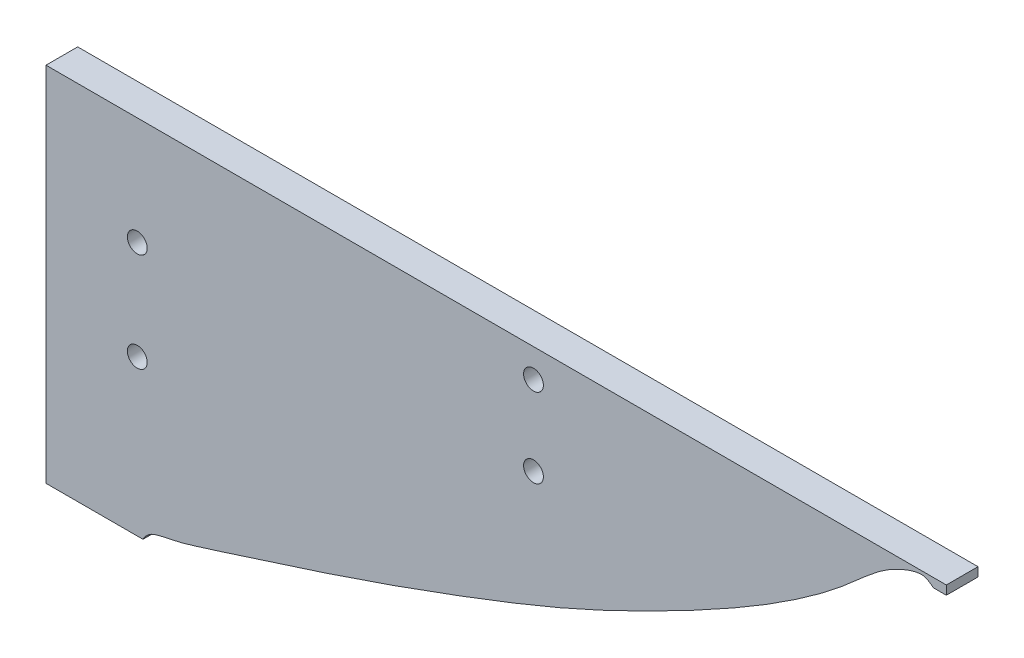
ISO-10303-21;
HEADER;
FILE_DESCRIPTION(('STEP AP214'),'2;1');
FILE_NAME('part.step','',(''),(''),'','','');
FILE_SCHEMA(('AUTOMOTIVE_DESIGN { 1 0 10303 214 1 1 1 1 }'));
ENDSEC;
DATA;
#1=APPLICATION_CONTEXT('core data for automotive mechanical design processes');
#2=APPLICATION_PROTOCOL_DEFINITION('international standard','automotive_design',2000,#1);
#3=PRODUCT_CONTEXT('',#1,'mechanical');
#4=PRODUCT('Part','Part','',(#3));
#5=PRODUCT_RELATED_PRODUCT_CATEGORY('part','',(#4));
#6=PRODUCT_DEFINITION_FORMATION('','',#4);
#7=PRODUCT_DEFINITION_CONTEXT('part definition',#1,'design');
#8=PRODUCT_DEFINITION('design','',#6,#7);
#9=PRODUCT_DEFINITION_SHAPE('','',#8);
#10=(LENGTH_UNIT() NAMED_UNIT(*) SI_UNIT(.MILLI.,.METRE.));
#11=(NAMED_UNIT(*) PLANE_ANGLE_UNIT() SI_UNIT($,.RADIAN.));
#12=(NAMED_UNIT(*) SI_UNIT($,.STERADIAN.) SOLID_ANGLE_UNIT());
#13=UNCERTAINTY_MEASURE_WITH_UNIT(LENGTH_MEASURE(1.E-05),#10,'distance_accuracy_value','');
#14=(GEOMETRIC_REPRESENTATION_CONTEXT(3) GLOBAL_UNCERTAINTY_ASSIGNED_CONTEXT((#13)) GLOBAL_UNIT_ASSIGNED_CONTEXT((#10,
#11,#12)) REPRESENTATION_CONTEXT('',''));
#15=CARTESIAN_POINT('',(0.,0.,0.));
#16=DIRECTION('',(0.,0.,1.));
#17=DIRECTION('',(1.,0.,0.));
#18=AXIS2_PLACEMENT_3D('',#15,#16,#17);
#19=CARTESIAN_POINT('',(5.3465749937326,-52.1213664446041,172.));
#20=DIRECTION('',(0.,0.,-1.));
#21=DIRECTION('',(-1.,0.,0.));
#22=AXIS2_PLACEMENT_3D('',#19,#20,#21);
#23=PLANE('',#22);
#24=CARTESIAN_POINT('',(-100.,-50.,172.));
#25=DIRECTION('',(0.,0.,-1.));
#26=DIRECTION('',(-1.,0.,0.));
#27=AXIS2_PLACEMENT_3D('',#24,#25,#26);
#28=CIRCLE('',#27,2.5);
#29=CARTESIAN_POINT('',(-102.5,-50.,172.));
#30=VERTEX_POINT('',#29);
#31=EDGE_CURVE('E242',#30,#30,#28,.F.);
#32=ORIENTED_EDGE('',*,*,#31,.F.);
#33=EDGE_LOOP('',(#32));
#34=FACE_BOUND('',#33,.T.);
#35=CARTESIAN_POINT('',(0.0705666698621599,-4.96037406111782,172.));
#36=DIRECTION('',(0.,0.,-1.));
#37=DIRECTION('',(-1.,0.,0.));
#38=AXIS2_PLACEMENT_3D('',#35,#36,#37);
#39=CIRCLE('',#38,2.5);
#40=CARTESIAN_POINT('',(-2.42943333013784,-4.96037406111782,172.));
#41=VERTEX_POINT('',#40);
#42=EDGE_CURVE('E238',#41,#41,#39,.F.);
#43=ORIENTED_EDGE('',*,*,#42,.F.);
#44=EDGE_LOOP('',(#43));
#45=FACE_BOUND('',#44,.T.);
#46=CARTESIAN_POINT('',(100.970721138816,0.,172.));
#47=CARTESIAN_POINT('',(100.937143984889,0.0671630142842144,172.));
#48=CARTESIAN_POINT('',(100.892957933651,0.12830917154544,172.));
#49=CARTESIAN_POINT('',(100.7918232478,0.236244274097825,172.));
#50=CARTESIAN_POINT('',(100.734243074779,0.284521266900521,172.));
#51=CARTESIAN_POINT('',(100.554308230617,0.418438841701149,172.));
#52=CARTESIAN_POINT('',(100.427068587045,0.496099921758563,172.));
#53=CARTESIAN_POINT('',(100.174029914827,0.653720018802889,172.));
#54=CARTESIAN_POINT('',(100.049250828068,0.735305953629353,172.));
#55=CARTESIAN_POINT('',(99.7959968868066,0.892582673220089,172.));
#56=CARTESIAN_POINT('',(99.6668355637838,0.967359721666077,172.));
#57=CARTESIAN_POINT('',(99.4014652777744,1.10492965349398,172.));
#58=CARTESIAN_POINT('',(99.2667520085641,1.16755174673251,172.));
#59=CARTESIAN_POINT('',(98.989629704436,1.26941078880054,172.));
#60=CARTESIAN_POINT('',(98.8469731584512,1.30789562507074,172.));
#61=CARTESIAN_POINT('',(98.5545011495643,1.36311147709683,172.));
#62=CARTESIAN_POINT('',(98.404531252504,1.3796333940752,172.));
#63=CARTESIAN_POINT('',(98.1079482415363,1.39455654052937,172.));
#64=CARTESIAN_POINT('',(97.9600153986431,1.39326553424899,172.));
#65=CARTESIAN_POINT('',(97.5169672388434,1.37108097846786,172.));
#66=CARTESIAN_POINT('',(97.2217517236348,1.33203841221391,172.));
#67=CARTESIAN_POINT('',(96.6361604767817,1.22885113425226,172.));
#68=CARTESIAN_POINT('',(96.3473979833977,1.16565581343159,172.));
#69=CARTESIAN_POINT('',(95.4917914564663,0.945345074007086,172.));
#70=CARTESIAN_POINT('',(94.9353050128339,0.758435063719706,172.));
#71=CARTESIAN_POINT('',(93.8352721530819,0.347391824299859,172.));
#72=CARTESIAN_POINT('',(93.2922955891301,0.121619361252646,172.));
#73=CARTESIAN_POINT('',(92.2188581167213,-0.365928037248908,172.));
#74=CARTESIAN_POINT('',(91.6879711513455,-0.627268886462194,172.));
#75=CARTESIAN_POINT('',(90.1323157641524,-1.44984119985145,172.));
#76=CARTESIAN_POINT('',(89.1383660305235,-2.05429107250875,172.));
#77=CARTESIAN_POINT('',(86.2796066329252,-4.02756705873377,172.));
#78=CARTESIAN_POINT('',(84.5279921344107,-5.54346377629478,172.));
#79=CARTESIAN_POINT('',(81.9218530789298,-7.84496072625825,172.));
#80=CARTESIAN_POINT('',(81.0555571550781,-8.61526682458123,172.));
#81=CARTESIAN_POINT('',(79.3064723040644,-10.1344502265541,172.));
#82=CARTESIAN_POINT('',(78.4253946679848,-10.8855509521329,172.));
#83=CARTESIAN_POINT('',(75.7475612493525,-13.0938978700327,172.));
#84=CARTESIAN_POINT('',(73.9178401172508,-14.5042591950759,172.));
#85=CARTESIAN_POINT('',(70.2051758167612,-17.2374865710006,172.));
#86=CARTESIAN_POINT('',(68.3212967840875,-18.5617148784408,172.));
#87=CARTESIAN_POINT('',(64.5130705707045,-21.147904633979,172.));
#88=CARTESIAN_POINT('',(62.5878377572783,-22.4085033914057,172.));
#89=CARTESIAN_POINT('',(58.6955272335455,-24.8653156938211,172.));
#90=CARTESIAN_POINT('',(56.729033607721,-26.0624279482406,172.));
#91=CARTESIAN_POINT('',(52.7640855094267,-28.4074754712496,172.));
#92=CARTESIAN_POINT('',(50.7657478943056,-29.5555905439677,172.));
#93=CARTESIAN_POINT('',(46.7462812540538,-31.8167523803714,172.));
#94=CARTESIAN_POINT('',(44.7248894575554,-32.9295593332157,172.));
#95=CARTESIAN_POINT('',(38.6366147885388,-36.218318883597,172.));
#96=CARTESIAN_POINT('',(34.5439243441606,-38.3469514944818,172.));
#97=CARTESIAN_POINT('',(26.3041288145536,-42.5001859626545,172.));
#98=CARTESIAN_POINT('',(22.1588751473303,-44.5242013215348,172.));
#99=CARTESIAN_POINT('',(13.8020521552322,-48.434657446594,172.));
#100=CARTESIAN_POINT('',(9.58925206741187,-50.3166142665798,172.));
#101=CARTESIAN_POINT('',(1.10389792005377,-53.9261186226283,172.));
#102=CARTESIAN_POINT('',(-3.16965839636964,-55.6553036373644,172.));
#103=CARTESIAN_POINT('',(-11.7557136420966,-59.0183739598217,172.));
#104=CARTESIAN_POINT('',(-16.0670882084985,-60.6559879065782,172.));
#105=CARTESIAN_POINT('',(-24.7104276599877,-63.8763184677953,172.));
#106=CARTESIAN_POINT('',(-29.0422415777458,-65.4577623499878,172.));
#107=CARTESIAN_POINT('',(-37.7305358777393,-68.5508115946746,172.));
#108=CARTESIAN_POINT('',(-42.087494292581,-70.0610634964963,172.));
#109=CARTESIAN_POINT('',(-50.8258411367041,-73.0123982448723,172.));
#110=CARTESIAN_POINT('',(-55.207266370663,-74.4535000257743,172.));
#111=CARTESIAN_POINT('',(-63.9811224506532,-77.3004555359724,172.));
#112=CARTESIAN_POINT('',(-68.3730580194176,-78.7084871466127,172.));
#113=CARTESIAN_POINT('',(-74.9633887642306,-80.8128537311599,172.));
#114=CARTESIAN_POINT('',(-77.1605658290607,-81.5130509458673,172.));
#115=CARTESIAN_POINT('',(-80.4591657952518,-82.5543998727962,172.));
#116=CARTESIAN_POINT('',(-81.5591923717393,-82.8999848812866,172.));
#117=CARTESIAN_POINT('',(-83.7600931405502,-83.58834217406,172.));
#118=CARTESIAN_POINT('',(-84.8600702154096,-83.9341013353587,172.));
#119=CARTESIAN_POINT('',(-87.0661453917024,-84.6051798129182,172.));
#120=CARTESIAN_POINT('',(-88.1733544426353,-84.9269083455371,172.));
#121=CARTESIAN_POINT('',(-89.8493783968855,-85.358347144698,172.));
#122=CARTESIAN_POINT('',(-90.4102721640395,-85.4939221135743,172.));
#123=CARTESIAN_POINT('',(-91.536884929403,-85.7471594747468,172.));
#124=CARTESIAN_POINT('',(-92.1034051485897,-85.8618475157741,172.));
#125=CARTESIAN_POINT('',(-93.2384684602684,-86.0837141391985,172.));
#126=CARTESIAN_POINT('',(-93.8059079401686,-86.194989633192,172.));
#127=CARTESIAN_POINT('',(-94.6469748492172,-86.3993682904544,172.));
#128=CARTESIAN_POINT('',(-94.9257008271005,-86.47354424721,172.));
#129=CARTESIAN_POINT('',(-95.4779747621524,-86.6411183889464,172.));
#130=CARTESIAN_POINT('',(-95.7514624493921,-86.7347403123772,172.));
#131=CARTESIAN_POINT('',(-96.2886341570568,-86.9583780501341,172.));
#132=CARTESIAN_POINT('',(-96.5531516672899,-87.0885615066675,172.));
#133=CARTESIAN_POINT('',(-97.062570593168,-87.4083895415917,172.));
#134=CARTESIAN_POINT('',(-97.2928936459848,-87.5945267042762,172.));
#135=CARTESIAN_POINT('',(-97.612836337745,-87.9011980990851,172.));
#136=CARTESIAN_POINT('',(-97.7156600616324,-88.0075337412868,172.));
#137=CARTESIAN_POINT('',(-97.9138219871909,-88.2282543423036,172.));
#138=CARTESIAN_POINT('',(-98.0094753876009,-88.3423003622484,172.));
#139=CARTESIAN_POINT('',(-98.2008713928624,-88.5702964789981,172.));
#140=CARTESIAN_POINT('',(-98.2955142901703,-88.6851966751947,172.));
#141=CARTESIAN_POINT('',(-98.4639500946093,-88.9304343972609,172.));
#142=CARTESIAN_POINT('',(-98.5369428664735,-89.0639017310369,172.));
#143=CARTESIAN_POINT('',(-98.5654782066456,-89.2102850785614,172.));
#144=B_SPLINE_CURVE_WITH_KNOTS('',3,(#46,#47,#48,#49,#50,#51,#52,#53,#54,#55,#56,#57,#58,#59,
#60,#61,#62,#63,#64,#65,#66,#67,#68,#69,#70,#71,#72,#73,#74,#75,#76,#77,#78,#79,#80,#81,#82,#83,
#84,#85,#86,#87,#88,#89,#90,#91,#92,#93,#94,#95,#96,#97,#98,#99,#100,#101,#102,#103,#104,#105,
#106,#107,#108,#109,#110,#111,#112,#113,#114,#115,#116,#117,#118,#119,#120,#121,#122,#123,#124,
#125,#126,#127,#128,#129,#130,#131,#132,#133,#134,#135,#136,#137,#138,#139,#140,#141,#142,#143),
.UNSPECIFIED.,.F.,.F.,(4,2,2,2,2,2,2,2,2,2,2,2,2,2,2,2,2,2,2,2,2,2,2,2,2,2,2,2,2,2,2,2,2,2,2,2,
2,2,2,2,2,2,2,2,2,2,2,2,4),(0.,0.0009765625,0.001953125,0.00390624999999989,0.00585937499999967,
0.00781249999999956,0.00976562499999944,0.0117187499999992,0.0136718749999991,0.015624999999999,
0.0195312499999989,0.0234374999999987,0.0312499999999987,0.0390624999999987,0.0468749999999986,
0.0624999999999984,0.0937499999999982,0.109374999999998,0.124999999999998,0.156249999999998,
0.187499999999998,0.218749999999998,0.249999999999998,0.281249999999998,0.312499999999999,
0.374999999999999,0.437499999999999,0.499999999999999,0.562499999999999,0.624999999999999,
0.687499999999999,0.749999999999999,0.8125,0.875,0.90625,0.921875,0.9375,0.953125,0.9609375,
0.96875,0.9765625,0.98046875,0.984375,0.98828125,0.9921875,0.994140625,0.99609375,0.998046875,
1.),.UNSPECIFIED.);
#145=CARTESIAN_POINT('',(-98.5654782066456,-89.2102850785613,172.));
#146=VERTEX_POINT('',#145);
#147=CARTESIAN_POINT('',(100.970721138816,0.,172.));
#148=VERTEX_POINT('',#147);
#149=EDGE_CURVE('E196',#146,#148,#144,.F.);
#150=ORIENTED_EDGE('',*,*,#149,.T.);
#151=DIRECTION('',(1.,0.,0.));
#152=VECTOR('',#151,1.);
#153=CARTESIAN_POINT('',(100.970721138816,0.,172.));
#154=LINE('',#153,#152);
#155=CARTESIAN_POINT('',(104.340662266709,0.,172.));
#156=VERTEX_POINT('',#155);
#157=EDGE_CURVE('E90',#148,#156,#154,.T.);
#158=ORIENTED_EDGE('',*,*,#157,.T.);
#159=DIRECTION('',(0.,1.,0.));
#160=VECTOR('',#159,1.);
#161=CARTESIAN_POINT('',(104.340662266709,2.25600000000004,172.));
#162=LINE('',#161,#160);
#163=CARTESIAN_POINT('',(104.340662266709,2.25600000000004,172.));
#164=VERTEX_POINT('',#163);
#165=EDGE_CURVE('E103',#156,#164,#162,.T.);
#166=ORIENTED_EDGE('',*,*,#165,.T.);
#167=DIRECTION('',(-1.,0.,0.));
#168=VECTOR('',#167,1.);
#169=CARTESIAN_POINT('',(104.340662266709,2.25600000000004,172.));
#170=LINE('',#169,#168);
#171=CARTESIAN_POINT('',(-123.056286661336,2.25600000000002,172.));
#172=VERTEX_POINT('',#171);
#173=EDGE_CURVE('E97',#164,#172,#170,.T.);
#174=ORIENTED_EDGE('',*,*,#173,.T.);
#175=DIRECTION('',(0.,-1.,0.));
#176=VECTOR('',#175,1.);
#177=CARTESIAN_POINT('',(-123.056286661336,-89.22001834219,172.));
#178=LINE('',#177,#176);
#179=CARTESIAN_POINT('',(-123.056286661336,-89.22001834219,172.));
#180=VERTEX_POINT('',#179);
#181=EDGE_CURVE('E101',#172,#180,#178,.T.);
#182=ORIENTED_EDGE('',*,*,#181,.T.);
#183=CARTESIAN_POINT('',(-98.5654782066456,-89.2102850785613,172.));
#184=CARTESIAN_POINT('',(-106.729080407975,-89.2148236384681,172.));
#185=CARTESIAN_POINT('',(-114.892683458794,-89.2179564181053,172.));
#186=CARTESIAN_POINT('',(-123.056286661336,-89.22001834219,172.));
#187=B_SPLINE_CURVE_WITH_KNOTS('',3,(#183,#184,#185,#186),.UNSPECIFIED.,.F.,.F.,(4,4),(0.,1.),.UNSPECIFIED.);
#188=EDGE_CURVE('E51',#180,#146,#187,.F.);
#189=ORIENTED_EDGE('',*,*,#188,.T.);
#190=EDGE_LOOP('',(#150,#158,#166,#174,#182,#189));
#191=FACE_BOUND('',#190,.T.);
#192=CARTESIAN_POINT('',(0.0705666698621599,-25.,172.));
#193=DIRECTION('',(0.,0.,-1.));
#194=DIRECTION('',(-1.,0.,0.));
#195=AXIS2_PLACEMENT_3D('',#192,#193,#194);
#196=CIRCLE('',#195,2.5);
#197=CARTESIAN_POINT('',(-2.42943333013784,-25.,172.));
#198=VERTEX_POINT('',#197);
#199=EDGE_CURVE('E239',#198,#198,#196,.F.);
#200=ORIENTED_EDGE('',*,*,#199,.F.);
#201=EDGE_LOOP('',(#200));
#202=FACE_BOUND('',#201,.T.);
#203=CARTESIAN_POINT('',(-100.,-25.,172.));
#204=DIRECTION('',(0.,0.,-1.));
#205=DIRECTION('',(-1.,0.,0.));
#206=AXIS2_PLACEMENT_3D('',#203,#204,#205);
#207=CIRCLE('',#206,2.5);
#208=CARTESIAN_POINT('',(-102.5,-25.,172.));
#209=VERTEX_POINT('',#208);
#210=EDGE_CURVE('E245',#209,#209,#207,.F.);
#211=ORIENTED_EDGE('',*,*,#210,.F.);
#212=EDGE_LOOP('',(#211));
#213=FACE_BOUND('',#212,.T.);
#214=ADVANCED_FACE('F30',(#34,#45,#191,#202,#213),#23,.F.);
#215=CARTESIAN_POINT('',(5.3465749937326,-52.1213664446041,164.));
#216=DIRECTION('',(0.,0.,-1.));
#217=DIRECTION('',(-1.,0.,0.));
#218=AXIS2_PLACEMENT_3D('',#215,#216,#217);
#219=PLANE('',#218);
#220=CARTESIAN_POINT('',(-100.,-50.,164.));
#221=DIRECTION('',(0.,0.,-1.));
#222=DIRECTION('',(-1.,0.,0.));
#223=AXIS2_PLACEMENT_3D('',#220,#221,#222);
#224=CIRCLE('',#223,2.5);
#225=CARTESIAN_POINT('',(-102.5,-50.,164.));
#226=VERTEX_POINT('',#225);
#227=EDGE_CURVE('E243',#226,#226,#224,.F.);
#228=ORIENTED_EDGE('',*,*,#227,.T.);
#229=EDGE_LOOP('',(#228));
#230=FACE_BOUND('',#229,.T.);
#231=CARTESIAN_POINT('',(0.0705666698621599,-4.96037406111782,164.));
#232=DIRECTION('',(0.,0.,-1.));
#233=DIRECTION('',(-1.,0.,0.));
#234=AXIS2_PLACEMENT_3D('',#231,#232,#233);
#235=CIRCLE('',#234,2.5);
#236=CARTESIAN_POINT('',(-2.42943333013784,-4.96037406111782,164.));
#237=VERTEX_POINT('',#236);
#238=EDGE_CURVE('E235',#237,#237,#235,.F.);
#239=ORIENTED_EDGE('',*,*,#238,.T.);
#240=EDGE_LOOP('',(#239));
#241=FACE_BOUND('',#240,.T.);
#242=CARTESIAN_POINT('',(-98.5654782066456,-89.2102850785614,164.));
#243=CARTESIAN_POINT('',(-98.5369428664735,-89.0639017310369,164.));
#244=CARTESIAN_POINT('',(-98.4639500946093,-88.9304343972609,164.));
#245=CARTESIAN_POINT('',(-98.2955142901703,-88.6851966751947,164.));
#246=CARTESIAN_POINT('',(-98.2008713928624,-88.5702964789981,164.));
#247=CARTESIAN_POINT('',(-98.0094753876009,-88.3423003622484,164.));
#248=CARTESIAN_POINT('',(-97.9138219871909,-88.2282543423036,164.));
#249=CARTESIAN_POINT('',(-97.7156600616324,-88.0075337412868,164.));
#250=CARTESIAN_POINT('',(-97.612836337745,-87.9011980990851,164.));
#251=CARTESIAN_POINT('',(-97.2928936459848,-87.5945267042762,164.));
#252=CARTESIAN_POINT('',(-97.062570593168,-87.4083895415917,164.));
#253=CARTESIAN_POINT('',(-96.5531516672899,-87.0885615066675,164.));
#254=CARTESIAN_POINT('',(-96.2886341570568,-86.9583780501341,164.));
#255=CARTESIAN_POINT('',(-95.7514624493921,-86.7347403123772,164.));
#256=CARTESIAN_POINT('',(-95.4779747621524,-86.6411183889464,164.));
#257=CARTESIAN_POINT('',(-94.9257008271005,-86.47354424721,164.));
#258=CARTESIAN_POINT('',(-94.6469748492172,-86.3993682904544,164.));
#259=CARTESIAN_POINT('',(-93.8059079401686,-86.194989633192,164.));
#260=CARTESIAN_POINT('',(-93.2384684602684,-86.0837141391985,164.));
#261=CARTESIAN_POINT('',(-92.1034051485897,-85.8618475157741,164.));
#262=CARTESIAN_POINT('',(-91.536884929403,-85.7471594747468,164.));
#263=CARTESIAN_POINT('',(-90.4102721640395,-85.4939221135743,164.));
#264=CARTESIAN_POINT('',(-89.8493783968855,-85.358347144698,164.));
#265=CARTESIAN_POINT('',(-88.1733544426353,-84.9269083455371,164.));
#266=CARTESIAN_POINT('',(-87.0661453917024,-84.6051798129182,164.));
#267=CARTESIAN_POINT('',(-84.8600702154096,-83.9341013353587,164.));
#268=CARTESIAN_POINT('',(-83.7600931405502,-83.58834217406,164.));
#269=CARTESIAN_POINT('',(-81.5591923717393,-82.8999848812866,164.));
#270=CARTESIAN_POINT('',(-80.4591657952518,-82.5543998727962,164.));
#271=CARTESIAN_POINT('',(-77.1605658290607,-81.5130509458673,164.));
#272=CARTESIAN_POINT('',(-74.9633887642306,-80.8128537311599,164.));
#273=CARTESIAN_POINT('',(-68.3730580194176,-78.7084871466127,164.));
#274=CARTESIAN_POINT('',(-63.9811224506532,-77.3004555359724,164.));
#275=CARTESIAN_POINT('',(-55.207266370663,-74.4535000257743,164.));
#276=CARTESIAN_POINT('',(-50.8258411367041,-73.0123982448723,164.));
#277=CARTESIAN_POINT('',(-42.087494292581,-70.0610634964963,164.));
#278=CARTESIAN_POINT('',(-37.7305358777393,-68.5508115946746,164.));
#279=CARTESIAN_POINT('',(-29.0422415777458,-65.4577623499878,164.));
#280=CARTESIAN_POINT('',(-24.7104276599877,-63.8763184677953,164.));
#281=CARTESIAN_POINT('',(-16.0670882084985,-60.6559879065782,164.));
#282=CARTESIAN_POINT('',(-11.7557136420966,-59.0183739598217,164.));
#283=CARTESIAN_POINT('',(-3.16965839636964,-55.6553036373644,164.));
#284=CARTESIAN_POINT('',(1.10389792005377,-53.9261186226283,164.));
#285=CARTESIAN_POINT('',(9.58925206741187,-50.3166142665798,164.));
#286=CARTESIAN_POINT('',(13.8020521552322,-48.434657446594,164.));
#287=CARTESIAN_POINT('',(22.1588751473303,-44.5242013215348,164.));
#288=CARTESIAN_POINT('',(26.3041288145536,-42.5001859626545,164.));
#289=CARTESIAN_POINT('',(34.5439243441606,-38.3469514944818,164.));
#290=CARTESIAN_POINT('',(38.6366147885388,-36.218318883597,164.));
#291=CARTESIAN_POINT('',(44.7248894575554,-32.9295593332157,164.));
#292=CARTESIAN_POINT('',(46.7462812540538,-31.8167523803714,164.));
#293=CARTESIAN_POINT('',(50.7657478943056,-29.5555905439677,164.));
#294=CARTESIAN_POINT('',(52.7640855094267,-28.4074754712496,164.));
#295=CARTESIAN_POINT('',(56.729033607721,-26.0624279482406,164.));
#296=CARTESIAN_POINT('',(58.6955272335455,-24.8653156938211,164.));
#297=CARTESIAN_POINT('',(62.5878377572783,-22.4085033914057,164.));
#298=CARTESIAN_POINT('',(64.5130705707045,-21.147904633979,164.));
#299=CARTESIAN_POINT('',(68.3212967840875,-18.5617148784408,164.));
#300=CARTESIAN_POINT('',(70.2051758167612,-17.2374865710006,164.));
#301=CARTESIAN_POINT('',(73.9178401172508,-14.5042591950759,164.));
#302=CARTESIAN_POINT('',(75.7475612493525,-13.0938978700327,164.));
#303=CARTESIAN_POINT('',(78.4253946679848,-10.8855509521329,164.));
#304=CARTESIAN_POINT('',(79.3064723040644,-10.1344502265541,164.));
#305=CARTESIAN_POINT('',(81.0555571550781,-8.61526682458123,164.));
#306=CARTESIAN_POINT('',(81.9218530789298,-7.84496072625825,164.));
#307=CARTESIAN_POINT('',(84.5279921344107,-5.54346377629478,164.));
#308=CARTESIAN_POINT('',(86.2796066329252,-4.02756705873377,164.));
#309=CARTESIAN_POINT('',(89.1383660305235,-2.05429107250875,164.));
#310=CARTESIAN_POINT('',(90.1323157641524,-1.44984119985145,164.));
#311=CARTESIAN_POINT('',(91.6879711513455,-0.627268886462194,164.));
#312=CARTESIAN_POINT('',(92.2188581167213,-0.365928037248908,164.));
#313=CARTESIAN_POINT('',(93.2922955891301,0.121619361252646,164.));
#314=CARTESIAN_POINT('',(93.8352721530819,0.347391824299859,164.));
#315=CARTESIAN_POINT('',(94.9353050128339,0.758435063719706,164.));
#316=CARTESIAN_POINT('',(95.4917914564663,0.945345074007086,164.));
#317=CARTESIAN_POINT('',(96.3473979833977,1.16565581343159,164.));
#318=CARTESIAN_POINT('',(96.6361604767817,1.22885113425226,164.));
#319=CARTESIAN_POINT('',(97.2217517236348,1.33203841221391,164.));
#320=CARTESIAN_POINT('',(97.5169672388434,1.37108097846786,164.));
#321=CARTESIAN_POINT('',(97.9600153986431,1.39326553424899,164.));
#322=CARTESIAN_POINT('',(98.1079482415363,1.39455654052937,164.));
#323=CARTESIAN_POINT('',(98.404531252504,1.3796333940752,164.));
#324=CARTESIAN_POINT('',(98.5545011495643,1.36311147709683,164.));
#325=CARTESIAN_POINT('',(98.8469731584512,1.30789562507074,164.));
#326=CARTESIAN_POINT('',(98.989629704436,1.26941078880054,164.));
#327=CARTESIAN_POINT('',(99.2667520085641,1.16755174673251,164.));
#328=CARTESIAN_POINT('',(99.4014652777744,1.10492965349398,164.));
#329=CARTESIAN_POINT('',(99.6668355637838,0.967359721666077,164.));
#330=CARTESIAN_POINT('',(99.7959968868066,0.892582673220089,164.));
#331=CARTESIAN_POINT('',(100.049250828068,0.735305953629353,164.));
#332=CARTESIAN_POINT('',(100.174029914827,0.653720018802889,164.));
#333=CARTESIAN_POINT('',(100.427068587045,0.496099921758563,164.));
#334=CARTESIAN_POINT('',(100.554308230617,0.418438841701149,164.));
#335=CARTESIAN_POINT('',(100.734243074779,0.284521266900521,164.));
#336=CARTESIAN_POINT('',(100.7918232478,0.236244274097825,164.));
#337=CARTESIAN_POINT('',(100.892957933651,0.12830917154544,164.));
#338=CARTESIAN_POINT('',(100.937143984889,0.0671630142842144,164.));
#339=CARTESIAN_POINT('',(100.970721138816,0.,164.));
#340=B_SPLINE_CURVE_WITH_KNOTS('',3,(#242,#243,#244,#245,#246,#247,#248,#249,#250,#251,#252,
#253,#254,#255,#256,#257,#258,#259,#260,#261,#262,#263,#264,#265,#266,#267,#268,#269,#270,#271,
#272,#273,#274,#275,#276,#277,#278,#279,#280,#281,#282,#283,#284,#285,#286,#287,#288,#289,#290,
#291,#292,#293,#294,#295,#296,#297,#298,#299,#300,#301,#302,#303,#304,#305,#306,#307,#308,#309,
#310,#311,#312,#313,#314,#315,#316,#317,#318,#319,#320,#321,#322,#323,#324,#325,#326,#327,#328,
#329,#330,#331,#332,#333,#334,#335,#336,#337,#338,#339),.UNSPECIFIED.,.F.,.F.,(4,2,2,2,2,2,2,2,
2,2,2,2,2,2,2,2,2,2,2,2,2,2,2,2,2,2,2,2,2,2,2,2,2,2,2,2,2,2,2,2,2,2,2,2,2,2,2,2,4),(0.,
0.00195312500000011,0.00390625000000011,0.00585937500000011,0.00781250000000011,
0.0117187500000001,0.0156250000000001,0.0195312500000001,0.0234375000000001,0.0312500000000002,
0.0390625000000002,0.0468750000000003,0.0625000000000003,0.0781250000000003,0.0937500000000003,
0.125,0.1875,0.250000000000001,0.312500000000001,0.375000000000001,0.437500000000001,
0.500000000000001,0.562500000000001,0.625000000000001,0.687500000000001,0.718750000000002,
0.750000000000002,0.781250000000002,0.812500000000002,0.843750000000002,0.875000000000002,
0.890625000000002,0.906250000000002,0.937500000000002,0.953125000000001,0.960937500000001,
0.968750000000001,0.976562500000001,0.980468750000001,0.984375000000001,0.986328125000001,
0.988281250000001,0.990234375000001,0.9921875,0.994140625,0.99609375,0.998046875,0.9990234375,
1.),.UNSPECIFIED.);
#341=CARTESIAN_POINT('',(-98.5654782066456,-89.2102850785613,164.));
#342=VERTEX_POINT('',#341);
#343=CARTESIAN_POINT('',(100.970721138816,0.,164.));
#344=VERTEX_POINT('',#343);
#345=EDGE_CURVE('E213',#342,#344,#340,.T.);
#346=ORIENTED_EDGE('',*,*,#345,.F.);
#347=CARTESIAN_POINT('',(-123.056286661336,-89.22001834219,164.));
#348=CARTESIAN_POINT('',(-114.892683458794,-89.2179564181053,164.));
#349=CARTESIAN_POINT('',(-106.729080407975,-89.2148236384681,164.));
#350=CARTESIAN_POINT('',(-98.5654782066456,-89.2102850785613,164.));
#351=B_SPLINE_CURVE_WITH_KNOTS('',3,(#347,#348,#349,#350),.UNSPECIFIED.,.F.,.F.,(4,4),(0.,1.),.UNSPECIFIED.);
#352=CARTESIAN_POINT('',(-123.056286661336,-89.22001834219,164.));
#353=VERTEX_POINT('',#352);
#354=EDGE_CURVE('E81',#353,#342,#351,.T.);
#355=ORIENTED_EDGE('',*,*,#354,.F.);
#356=DIRECTION('',(0.,-1.,0.));
#357=VECTOR('',#356,1.);
#358=CARTESIAN_POINT('',(-123.056286661336,-89.22001834219,164.));
#359=LINE('',#358,#357);
#360=CARTESIAN_POINT('',(-123.056286661336,2.25600000000002,164.));
#361=VERTEX_POINT('',#360);
#362=EDGE_CURVE('E75',#361,#353,#359,.T.);
#363=ORIENTED_EDGE('',*,*,#362,.F.);
#364=DIRECTION('',(-1.,0.,0.));
#365=VECTOR('',#364,1.);
#366=CARTESIAN_POINT('',(104.340662266709,2.25600000000004,164.));
#367=LINE('',#366,#365);
#368=CARTESIAN_POINT('',(104.340662266709,2.25600000000004,164.));
#369=VERTEX_POINT('',#368);
#370=EDGE_CURVE('E111',#369,#361,#367,.T.);
#371=ORIENTED_EDGE('',*,*,#370,.F.);
#372=DIRECTION('',(0.,1.,0.));
#373=VECTOR('',#372,1.);
#374=CARTESIAN_POINT('',(104.340662266709,2.25600000000004,164.));
#375=LINE('',#374,#373);
#376=CARTESIAN_POINT('',(104.340662266709,0.,164.));
#377=VERTEX_POINT('',#376);
#378=EDGE_CURVE('E158',#377,#369,#375,.T.);
#379=ORIENTED_EDGE('',*,*,#378,.F.);
#380=DIRECTION('',(1.,0.,0.));
#381=VECTOR('',#380,1.);
#382=CARTESIAN_POINT('',(100.970721138816,0.,164.));
#383=LINE('',#382,#381);
#384=EDGE_CURVE('E163',#344,#377,#383,.T.);
#385=ORIENTED_EDGE('',*,*,#384,.F.);
#386=EDGE_LOOP('',(#346,#355,#363,#371,#379,#385));
#387=FACE_BOUND('',#386,.T.);
#388=CARTESIAN_POINT('',(0.0705666698621599,-25.,164.));
#389=DIRECTION('',(0.,0.,-1.));
#390=DIRECTION('',(-1.,0.,0.));
#391=AXIS2_PLACEMENT_3D('',#388,#389,#390);
#392=CIRCLE('',#391,2.5);
#393=CARTESIAN_POINT('',(-2.42943333013784,-25.,164.));
#394=VERTEX_POINT('',#393);
#395=EDGE_CURVE('E240',#394,#394,#392,.F.);
#396=ORIENTED_EDGE('',*,*,#395,.T.);
#397=EDGE_LOOP('',(#396));
#398=FACE_BOUND('',#397,.T.);
#399=CARTESIAN_POINT('',(-100.,-25.,164.));
#400=DIRECTION('',(0.,0.,-1.));
#401=DIRECTION('',(-1.,0.,0.));
#402=AXIS2_PLACEMENT_3D('',#399,#400,#401);
#403=CIRCLE('',#402,2.5);
#404=CARTESIAN_POINT('',(-102.5,-25.,164.));
#405=VERTEX_POINT('',#404);
#406=EDGE_CURVE('E36',#405,#405,#403,.F.);
#407=ORIENTED_EDGE('',*,*,#406,.T.);
#408=EDGE_LOOP('',(#407));
#409=FACE_BOUND('',#408,.T.);
#410=ADVANCED_FACE('F148',(#230,#241,#387,#398,#409),#219,.T.);
#411=CARTESIAN_POINT('',(-98.5654782066456,-89.2102850785614,172.));
#412=CARTESIAN_POINT('',(-98.5369428664735,-89.0639017310369,172.));
#413=CARTESIAN_POINT('',(-98.4639500946093,-88.9304343972609,172.));
#414=CARTESIAN_POINT('',(-98.2955142901703,-88.6851966751947,172.));
#415=CARTESIAN_POINT('',(-98.2008713928624,-88.5702964789981,172.));
#416=CARTESIAN_POINT('',(-98.0094753876009,-88.3423003622484,172.));
#417=CARTESIAN_POINT('',(-97.9138219871909,-88.2282543423036,172.));
#418=CARTESIAN_POINT('',(-97.7156600616324,-88.0075337412868,172.));
#419=CARTESIAN_POINT('',(-97.612836337745,-87.9011980990851,172.));
#420=CARTESIAN_POINT('',(-97.2928936459848,-87.5945267042762,172.));
#421=CARTESIAN_POINT('',(-97.062570593168,-87.4083895415917,172.));
#422=CARTESIAN_POINT('',(-96.5531516672899,-87.0885615066675,172.));
#423=CARTESIAN_POINT('',(-96.2886341570568,-86.9583780501341,172.));
#424=CARTESIAN_POINT('',(-95.7514624493921,-86.7347403123772,172.));
#425=CARTESIAN_POINT('',(-95.4779747621524,-86.6411183889464,172.));
#426=CARTESIAN_POINT('',(-94.9257008271005,-86.47354424721,172.));
#427=CARTESIAN_POINT('',(-94.6469748492172,-86.3993682904544,172.));
#428=CARTESIAN_POINT('',(-93.8059079401686,-86.194989633192,172.));
#429=CARTESIAN_POINT('',(-93.2384684602684,-86.0837141391985,172.));
#430=CARTESIAN_POINT('',(-92.1034051485897,-85.8618475157741,172.));
#431=CARTESIAN_POINT('',(-91.536884929403,-85.7471594747468,172.));
#432=CARTESIAN_POINT('',(-90.4102721640395,-85.4939221135743,172.));
#433=CARTESIAN_POINT('',(-89.8493783968855,-85.358347144698,172.));
#434=CARTESIAN_POINT('',(-88.1733544426353,-84.9269083455371,172.));
#435=CARTESIAN_POINT('',(-87.0661453917024,-84.6051798129182,172.));
#436=CARTESIAN_POINT('',(-84.8600702154096,-83.9341013353587,172.));
#437=CARTESIAN_POINT('',(-83.7600931405502,-83.58834217406,172.));
#438=CARTESIAN_POINT('',(-81.5591923717393,-82.8999848812866,172.));
#439=CARTESIAN_POINT('',(-80.4591657952518,-82.5543998727962,172.));
#440=CARTESIAN_POINT('',(-77.1605658290607,-81.5130509458673,172.));
#441=CARTESIAN_POINT('',(-74.9633887642306,-80.8128537311599,172.));
#442=CARTESIAN_POINT('',(-68.3730580194176,-78.7084871466127,172.));
#443=CARTESIAN_POINT('',(-63.9811224506532,-77.3004555359724,172.));
#444=CARTESIAN_POINT('',(-55.207266370663,-74.4535000257743,172.));
#445=CARTESIAN_POINT('',(-50.8258411367041,-73.0123982448723,172.));
#446=CARTESIAN_POINT('',(-42.087494292581,-70.0610634964963,172.));
#447=CARTESIAN_POINT('',(-37.7305358777393,-68.5508115946746,172.));
#448=CARTESIAN_POINT('',(-29.0422415777458,-65.4577623499878,172.));
#449=CARTESIAN_POINT('',(-24.7104276599877,-63.8763184677953,172.));
#450=CARTESIAN_POINT('',(-16.0670882084985,-60.6559879065782,172.));
#451=CARTESIAN_POINT('',(-11.7557136420966,-59.0183739598217,172.));
#452=CARTESIAN_POINT('',(-3.16965839636964,-55.6553036373644,172.));
#453=CARTESIAN_POINT('',(1.10389792005377,-53.9261186226283,172.));
#454=CARTESIAN_POINT('',(9.58925206741187,-50.3166142665798,172.));
#455=CARTESIAN_POINT('',(13.8020521552322,-48.434657446594,172.));
#456=CARTESIAN_POINT('',(22.1588751473303,-44.5242013215348,172.));
#457=CARTESIAN_POINT('',(26.3041288145536,-42.5001859626545,172.));
#458=CARTESIAN_POINT('',(34.5439243441606,-38.3469514944818,172.));
#459=CARTESIAN_POINT('',(38.6366147885388,-36.218318883597,172.));
#460=CARTESIAN_POINT('',(44.7248894575554,-32.9295593332157,172.));
#461=CARTESIAN_POINT('',(46.7462812540538,-31.8167523803714,172.));
#462=CARTESIAN_POINT('',(50.7657478943056,-29.5555905439677,172.));
#463=CARTESIAN_POINT('',(52.7640855094267,-28.4074754712496,172.));
#464=CARTESIAN_POINT('',(56.729033607721,-26.0624279482406,172.));
#465=CARTESIAN_POINT('',(58.6955272335455,-24.8653156938211,172.));
#466=CARTESIAN_POINT('',(62.5878377572783,-22.4085033914057,172.));
#467=CARTESIAN_POINT('',(64.5130705707045,-21.147904633979,172.));
#468=CARTESIAN_POINT('',(68.3212967840875,-18.5617148784408,172.));
#469=CARTESIAN_POINT('',(70.2051758167612,-17.2374865710006,172.));
#470=CARTESIAN_POINT('',(73.9178401172508,-14.5042591950759,172.));
#471=CARTESIAN_POINT('',(75.7475612493525,-13.0938978700327,172.));
#472=CARTESIAN_POINT('',(78.4253946679848,-10.8855509521329,172.));
#473=CARTESIAN_POINT('',(79.3064723040644,-10.1344502265541,172.));
#474=CARTESIAN_POINT('',(81.0555571550781,-8.61526682458123,172.));
#475=CARTESIAN_POINT('',(81.9218530789298,-7.84496072625825,172.));
#476=CARTESIAN_POINT('',(84.5279921344107,-5.54346377629478,172.));
#477=CARTESIAN_POINT('',(86.2796066329252,-4.02756705873377,172.));
#478=CARTESIAN_POINT('',(89.1383660305235,-2.05429107250875,172.));
#479=CARTESIAN_POINT('',(90.1323157641524,-1.44984119985145,172.));
#480=CARTESIAN_POINT('',(91.6879711513455,-0.627268886462194,172.));
#481=CARTESIAN_POINT('',(92.2188581167213,-0.365928037248908,172.));
#482=CARTESIAN_POINT('',(93.2922955891301,0.121619361252646,172.));
#483=CARTESIAN_POINT('',(93.8352721530819,0.347391824299859,172.));
#484=CARTESIAN_POINT('',(94.9353050128339,0.758435063719706,172.));
#485=CARTESIAN_POINT('',(95.4917914564663,0.945345074007086,172.));
#486=CARTESIAN_POINT('',(96.3473979833977,1.16565581343159,172.));
#487=CARTESIAN_POINT('',(96.6361604767817,1.22885113425226,172.));
#488=CARTESIAN_POINT('',(97.2217517236348,1.33203841221391,172.));
#489=CARTESIAN_POINT('',(97.5169672388434,1.37108097846786,172.));
#490=CARTESIAN_POINT('',(97.9600153986431,1.39326553424899,172.));
#491=CARTESIAN_POINT('',(98.1079482415363,1.39455654052937,172.));
#492=CARTESIAN_POINT('',(98.404531252504,1.3796333940752,172.));
#493=CARTESIAN_POINT('',(98.5545011495643,1.36311147709683,172.));
#494=CARTESIAN_POINT('',(98.8469731584512,1.30789562507074,172.));
#495=CARTESIAN_POINT('',(98.989629704436,1.26941078880054,172.));
#496=CARTESIAN_POINT('',(99.2667520085641,1.16755174673251,172.));
#497=CARTESIAN_POINT('',(99.4014652777744,1.10492965349398,172.));
#498=CARTESIAN_POINT('',(99.6668355637838,0.967359721666077,172.));
#499=CARTESIAN_POINT('',(99.7959968868066,0.892582673220089,172.));
#500=CARTESIAN_POINT('',(100.049250828068,0.735305953629353,172.));
#501=CARTESIAN_POINT('',(100.174029914827,0.653720018802889,172.));
#502=CARTESIAN_POINT('',(100.427068587045,0.496099921758563,172.));
#503=CARTESIAN_POINT('',(100.554308230617,0.418438841701149,172.));
#504=CARTESIAN_POINT('',(100.734243074779,0.284521266900521,172.));
#505=CARTESIAN_POINT('',(100.7918232478,0.236244274097825,172.));
#506=CARTESIAN_POINT('',(100.892957933651,0.12830917154544,172.));
#507=CARTESIAN_POINT('',(100.937143984889,0.0671630142842144,172.));
#508=CARTESIAN_POINT('',(100.970721138816,0.,172.));
#509=B_SPLINE_CURVE_WITH_KNOTS('',3,(#411,#412,#413,#414,#415,#416,#417,#418,#419,#420,#421,
#422,#423,#424,#425,#426,#427,#428,#429,#430,#431,#432,#433,#434,#435,#436,#437,#438,#439,#440,
#441,#442,#443,#444,#445,#446,#447,#448,#449,#450,#451,#452,#453,#454,#455,#456,#457,#458,#459,
#460,#461,#462,#463,#464,#465,#466,#467,#468,#469,#470,#471,#472,#473,#474,#475,#476,#477,#478,
#479,#480,#481,#482,#483,#484,#485,#486,#487,#488,#489,#490,#491,#492,#493,#494,#495,#496,#497,
#498,#499,#500,#501,#502,#503,#504,#505,#506,#507,#508),.UNSPECIFIED.,.F.,.F.,(4,2,2,2,2,2,2,2,
2,2,2,2,2,2,2,2,2,2,2,2,2,2,2,2,2,2,2,2,2,2,2,2,2,2,2,2,2,2,2,2,2,2,2,2,2,2,2,2,4),(0.,
0.00195312500000011,0.00390625000000011,0.00585937500000011,0.00781250000000011,
0.0117187500000001,0.0156250000000001,0.0195312500000001,0.0234375000000001,0.0312500000000002,
0.0390625000000002,0.0468750000000003,0.0625000000000003,0.0781250000000003,0.0937500000000003,
0.125,0.1875,0.250000000000001,0.312500000000001,0.375000000000001,0.437500000000001,
0.500000000000001,0.562500000000001,0.625000000000001,0.687500000000001,0.718750000000002,
0.750000000000002,0.781250000000002,0.812500000000002,0.843750000000002,0.875000000000002,
0.890625000000002,0.906250000000002,0.937500000000002,0.953125000000001,0.960937500000001,
0.968750000000001,0.976562500000001,0.980468750000001,0.984375000000001,0.986328125000001,
0.988281250000001,0.990234375000001,0.9921875,0.994140625,0.99609375,0.998046875,0.9990234375,
1.),.UNSPECIFIED.);
#510=DIRECTION('',(0.,0.,-1.));
#511=VECTOR('',#510,1.);
#512=SURFACE_OF_LINEAR_EXTRUSION('',#509,#511);
#513=ORIENTED_EDGE('',*,*,#345,.T.);
#514=DIRECTION('',(0.,0.,-1.));
#515=VECTOR('',#514,1.);
#516=CARTESIAN_POINT('',(100.970721138816,0.,172.));
#517=LINE('',#516,#515);
#518=EDGE_CURVE('E11',#148,#344,#517,.T.);
#519=ORIENTED_EDGE('',*,*,#518,.F.);
#520=ORIENTED_EDGE('',*,*,#149,.F.);
#521=DIRECTION('',(0.,0.,-1.));
#522=VECTOR('',#521,1.);
#523=CARTESIAN_POINT('',(-98.5654782066456,-89.2102850785613,172.));
#524=LINE('',#523,#522);
#525=EDGE_CURVE('E117',#146,#342,#524,.T.);
#526=ORIENTED_EDGE('',*,*,#525,.T.);
#527=EDGE_LOOP('',(#513,#519,#520,#526));
#528=FACE_BOUND('',#527,.T.);
#529=ADVANCED_FACE('F32',(#528),#512,.F.);
#530=CARTESIAN_POINT('',(100.970721138816,0.,172.));
#531=DIRECTION('',(0.,1.,0.));
#532=DIRECTION('',(-1.,0.,0.));
#533=AXIS2_PLACEMENT_3D('',#530,#531,#532);
#534=PLANE('',#533);
#535=ORIENTED_EDGE('',*,*,#384,.T.);
#536=DIRECTION('',(0.,0.,-1.));
#537=VECTOR('',#536,1.);
#538=CARTESIAN_POINT('',(104.340662266709,0.,172.));
#539=LINE('',#538,#537);
#540=EDGE_CURVE('E42',#156,#377,#539,.T.);
#541=ORIENTED_EDGE('',*,*,#540,.F.);
#542=ORIENTED_EDGE('',*,*,#157,.F.);
#543=ORIENTED_EDGE('',*,*,#518,.T.);
#544=EDGE_LOOP('',(#535,#541,#542,#543));
#545=FACE_BOUND('',#544,.T.);
#546=ADVANCED_FACE('F338',(#545),#534,.F.);
#547=CARTESIAN_POINT('',(104.340662266709,2.25600000000004,172.));
#548=DIRECTION('',(-1.,0.,0.));
#549=DIRECTION('',(0.,-1.,0.));
#550=AXIS2_PLACEMENT_3D('',#547,#548,#549);
#551=PLANE('',#550);
#552=ORIENTED_EDGE('',*,*,#378,.T.);
#553=DIRECTION('',(0.,0.,-1.));
#554=VECTOR('',#553,1.);
#555=CARTESIAN_POINT('',(104.340662266709,2.25600000000004,172.));
#556=LINE('',#555,#554);
#557=EDGE_CURVE('E112',#164,#369,#556,.T.);
#558=ORIENTED_EDGE('',*,*,#557,.F.);
#559=ORIENTED_EDGE('',*,*,#165,.F.);
#560=ORIENTED_EDGE('',*,*,#540,.T.);
#561=EDGE_LOOP('',(#552,#558,#559,#560));
#562=FACE_BOUND('',#561,.T.);
#563=ADVANCED_FACE('F330',(#562),#551,.F.);
#564=CARTESIAN_POINT('',(104.340662266709,2.25600000000004,172.));
#565=DIRECTION('',(0.,-1.,0.));
#566=DIRECTION('',(1.,0.,0.));
#567=AXIS2_PLACEMENT_3D('',#564,#565,#566);
#568=PLANE('',#567);
#569=ORIENTED_EDGE('',*,*,#370,.T.);
#570=DIRECTION('',(0.,0.,-1.));
#571=VECTOR('',#570,1.);
#572=CARTESIAN_POINT('',(-123.056286661336,2.25600000000002,172.));
#573=LINE('',#572,#571);
#574=EDGE_CURVE('E108',#172,#361,#573,.T.);
#575=ORIENTED_EDGE('',*,*,#574,.F.);
#576=ORIENTED_EDGE('',*,*,#173,.F.);
#577=ORIENTED_EDGE('',*,*,#557,.T.);
#578=EDGE_LOOP('',(#569,#575,#576,#577));
#579=FACE_BOUND('',#578,.T.);
#580=ADVANCED_FACE('F109',(#579),#568,.F.);
#581=CARTESIAN_POINT('',(-123.056286661336,-89.22001834219,172.));
#582=DIRECTION('',(1.,0.,0.));
#583=DIRECTION('',(0.,1.,0.));
#584=AXIS2_PLACEMENT_3D('',#581,#582,#583);
#585=PLANE('',#584);
#586=ORIENTED_EDGE('',*,*,#362,.T.);
#587=DIRECTION('',(0.,0.,-1.));
#588=VECTOR('',#587,1.);
#589=CARTESIAN_POINT('',(-123.056286661336,-89.22001834219,172.));
#590=LINE('',#589,#588);
#591=EDGE_CURVE('E113',#180,#353,#590,.T.);
#592=ORIENTED_EDGE('',*,*,#591,.F.);
#593=ORIENTED_EDGE('',*,*,#181,.F.);
#594=ORIENTED_EDGE('',*,*,#574,.T.);
#595=EDGE_LOOP('',(#586,#592,#593,#594));
#596=FACE_BOUND('',#595,.T.);
#597=ADVANCED_FACE('F115',(#596),#585,.F.);
#598=CARTESIAN_POINT('',(-123.056286661336,-89.22001834219,172.));
#599=CARTESIAN_POINT('',(-114.892683458794,-89.2179564181053,172.));
#600=CARTESIAN_POINT('',(-106.729080407975,-89.2148236384681,172.));
#601=CARTESIAN_POINT('',(-98.5654782066456,-89.2102850785613,172.));
#602=B_SPLINE_CURVE_WITH_KNOTS('',3,(#598,#599,#600,#601),.UNSPECIFIED.,.F.,.F.,(4,4),(0.,1.),.UNSPECIFIED.);
#603=DIRECTION('',(0.,0.,-1.));
#604=VECTOR('',#603,1.);
#605=SURFACE_OF_LINEAR_EXTRUSION('',#602,#604);
#606=ORIENTED_EDGE('',*,*,#354,.T.);
#607=ORIENTED_EDGE('',*,*,#525,.F.);
#608=ORIENTED_EDGE('',*,*,#188,.F.);
#609=ORIENTED_EDGE('',*,*,#591,.T.);
#610=EDGE_LOOP('',(#606,#607,#608,#609));
#611=FACE_BOUND('',#610,.T.);
#612=ADVANCED_FACE('F136',(#611),#605,.F.);
#613=CARTESIAN_POINT('',(0.0705666698621599,-4.96037406111782,308.));
#614=DIRECTION('',(0.,0.,-1.));
#615=DIRECTION('',(-1.,0.,0.));
#616=AXIS2_PLACEMENT_3D('',#613,#614,#615);
#617=CYLINDRICAL_SURFACE('',#616,2.5);
#618=ORIENTED_EDGE('',*,*,#238,.F.);
#619=EDGE_LOOP('',(#618));
#620=FACE_BOUND('',#619,.T.);
#621=ORIENTED_EDGE('',*,*,#42,.T.);
#622=EDGE_LOOP('',(#621));
#623=FACE_BOUND('',#622,.T.);
#624=ADVANCED_FACE('F147',(#620,#623),#617,.F.);
#625=CARTESIAN_POINT('',(0.0705666698621599,-25.,308.));
#626=DIRECTION('',(0.,0.,-1.));
#627=DIRECTION('',(-1.,0.,0.));
#628=AXIS2_PLACEMENT_3D('',#625,#626,#627);
#629=CYLINDRICAL_SURFACE('',#628,2.5);
#630=ORIENTED_EDGE('',*,*,#395,.F.);
#631=EDGE_LOOP('',(#630));
#632=FACE_BOUND('',#631,.T.);
#633=ORIENTED_EDGE('',*,*,#199,.T.);
#634=EDGE_LOOP('',(#633));
#635=FACE_BOUND('',#634,.T.);
#636=ADVANCED_FACE('F269',(#632,#635),#629,.F.);
#637=CARTESIAN_POINT('',(-100.,-50.,308.));
#638=DIRECTION('',(0.,0.,-1.));
#639=DIRECTION('',(-1.,0.,0.));
#640=AXIS2_PLACEMENT_3D('',#637,#638,#639);
#641=CYLINDRICAL_SURFACE('',#640,2.5);
#642=ORIENTED_EDGE('',*,*,#227,.F.);
#643=EDGE_LOOP('',(#642));
#644=FACE_BOUND('',#643,.T.);
#645=ORIENTED_EDGE('',*,*,#31,.T.);
#646=EDGE_LOOP('',(#645));
#647=FACE_BOUND('',#646,.T.);
#648=ADVANCED_FACE('F274',(#644,#647),#641,.F.);
#649=CARTESIAN_POINT('',(-100.,-25.,308.));
#650=DIRECTION('',(0.,0.,-1.));
#651=DIRECTION('',(-1.,0.,0.));
#652=AXIS2_PLACEMENT_3D('',#649,#650,#651);
#653=CYLINDRICAL_SURFACE('',#652,2.5);
#654=ORIENTED_EDGE('',*,*,#406,.F.);
#655=EDGE_LOOP('',(#654));
#656=FACE_BOUND('',#655,.T.);
#657=ORIENTED_EDGE('',*,*,#210,.T.);
#658=EDGE_LOOP('',(#657));
#659=FACE_BOUND('',#658,.T.);
#660=ADVANCED_FACE('F284',(#656,#659),#653,.F.);
#661=CLOSED_SHELL('',(#214,#410,#529,#546,#563,#580,#597,#612,#624,#636,#648,#660));
#662=MANIFOLD_SOLID_BREP('B2',#661);
#663=ADVANCED_BREP_SHAPE_REPRESENTATION('',(#18,#662),#14);
#664=SHAPE_DEFINITION_REPRESENTATION(#9,#663);
ENDSEC;
END-ISO-10303-21;
